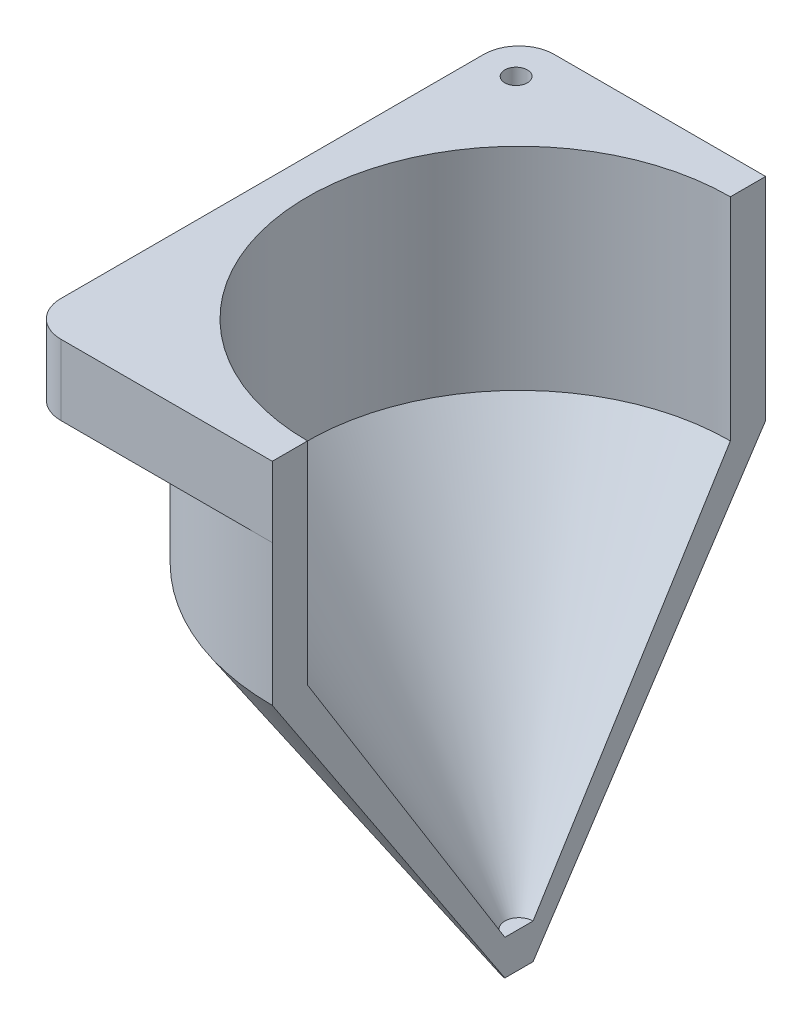
ISO-10303-21;
HEADER;
FILE_DESCRIPTION(('STEP AP214'),'2;1');
FILE_NAME('part.step','',(''),(''),'','','');
FILE_SCHEMA(('AUTOMOTIVE_DESIGN { 1 0 10303 214 1 1 1 1 }'));
ENDSEC;
DATA;
#1=APPLICATION_CONTEXT('core data for automotive mechanical design processes');
#2=APPLICATION_PROTOCOL_DEFINITION('international standard','automotive_design',2000,#1);
#3=PRODUCT_CONTEXT('',#1,'mechanical');
#4=PRODUCT('Part','Part','',(#3));
#5=PRODUCT_RELATED_PRODUCT_CATEGORY('part','',(#4));
#6=PRODUCT_DEFINITION_FORMATION('','',#4);
#7=PRODUCT_DEFINITION_CONTEXT('part definition',#1,'design');
#8=PRODUCT_DEFINITION('design','',#6,#7);
#9=PRODUCT_DEFINITION_SHAPE('','',#8);
#10=(LENGTH_UNIT() NAMED_UNIT(*) SI_UNIT(.MILLI.,.METRE.));
#11=(NAMED_UNIT(*) PLANE_ANGLE_UNIT() SI_UNIT($,.RADIAN.));
#12=(NAMED_UNIT(*) SI_UNIT($,.STERADIAN.) SOLID_ANGLE_UNIT());
#13=UNCERTAINTY_MEASURE_WITH_UNIT(LENGTH_MEASURE(1.E-05),#10,'distance_accuracy_value','');
#14=(GEOMETRIC_REPRESENTATION_CONTEXT(3) GLOBAL_UNCERTAINTY_ASSIGNED_CONTEXT((#13)) GLOBAL_UNIT_ASSIGNED_CONTEXT((#10,
#11,#12)) REPRESENTATION_CONTEXT('',''));
#15=CARTESIAN_POINT('',(0.,0.,0.));
#16=DIRECTION('',(0.,0.,1.));
#17=DIRECTION('',(1.,0.,0.));
#18=AXIS2_PLACEMENT_3D('',#15,#16,#17);
#19=CARTESIAN_POINT('',(0.,0.,0.));
#20=DIRECTION('',(1.,0.,0.));
#21=DIRECTION('',(0.,0.,-1.));
#22=AXIS2_PLACEMENT_3D('',#19,#20,#21);
#23=PLANE('',#22);
#24=DIRECTION('',(0.,-1.,0.));
#25=VECTOR('',#24,1.);
#26=CARTESIAN_POINT('',(0.,30.,-30.));
#27=LINE('',#26,#25);
#28=CARTESIAN_POINT('',(0.,0.,-30.));
#29=VERTEX_POINT('',#28);
#30=CARTESIAN_POINT('',(0.,30.,-30.));
#31=VERTEX_POINT('',#30);
#32=EDGE_CURVE('E216',#29,#31,#27,.F.);
#33=ORIENTED_EDGE('',*,*,#32,.F.);
#34=DIRECTION('',(0.,0.849056603773585,-0.528301886792453));
#35=VECTOR('',#34,1.);
#36=CARTESIAN_POINT('',(0.,-48.2142857142857,0.));
#37=LINE('',#36,#35);
#38=CARTESIAN_POINT('',(0.,-45.,-2.));
#39=VERTEX_POINT('',#38);
#40=EDGE_CURVE('E232',#29,#39,#37,.F.);
#41=ORIENTED_EDGE('',*,*,#40,.T.);
#42=DIRECTION('',(0.,0.,1.));
#43=VECTOR('',#42,1.);
#44=CARTESIAN_POINT('',(0.,-45.,0.));
#45=LINE('',#44,#43);
#46=CARTESIAN_POINT('',(0.,-45.,2.));
#47=VERTEX_POINT('',#46);
#48=EDGE_CURVE('E228',#39,#47,#45,.T.);
#49=ORIENTED_EDGE('',*,*,#48,.T.);
#50=DIRECTION('',(0.,-0.849056603773585,-0.528301886792453));
#51=VECTOR('',#50,1.);
#52=CARTESIAN_POINT('',(0.,-48.2142857142857,0.));
#53=LINE('',#52,#51);
#54=CARTESIAN_POINT('',(0.,0.,30.));
#55=VERTEX_POINT('',#54);
#56=EDGE_CURVE('E236',#47,#55,#53,.F.);
#57=ORIENTED_EDGE('',*,*,#56,.T.);
#58=DIRECTION('',(0.,-1.,0.));
#59=VECTOR('',#58,1.);
#60=CARTESIAN_POINT('',(0.,30.,30.));
#61=LINE('',#60,#59);
#62=CARTESIAN_POINT('',(0.,30.,30.));
#63=VERTEX_POINT('',#62);
#64=EDGE_CURVE('E219',#63,#55,#61,.T.);
#65=ORIENTED_EDGE('',*,*,#64,.F.);
#66=DIRECTION('',(0.,0.,-1.));
#67=VECTOR('',#66,1.);
#68=CARTESIAN_POINT('',(0.,30.,30.));
#69=LINE('',#68,#67);
#70=CARTESIAN_POINT('',(0.,30.,35.));
#71=VERTEX_POINT('',#70);
#72=EDGE_CURVE('E155',#71,#63,#69,.T.);
#73=ORIENTED_EDGE('',*,*,#72,.F.);
#74=DIRECTION('',(0.,1.,0.));
#75=VECTOR('',#74,1.);
#76=CARTESIAN_POINT('',(0.,30.,35.));
#77=LINE('',#76,#75);
#78=CARTESIAN_POINT('',(0.,20.,35.));
#79=VERTEX_POINT('',#78);
#80=EDGE_CURVE('E71',#79,#71,#77,.T.);
#81=ORIENTED_EDGE('',*,*,#80,.F.);
#82=DIRECTION('',(0.,-1.,0.));
#83=VECTOR('',#82,1.);
#84=CARTESIAN_POINT('',(0.,30.,35.));
#85=LINE('',#84,#83);
#86=CARTESIAN_POINT('',(0.,0.,35.));
#87=VERTEX_POINT('',#86);
#88=EDGE_CURVE('E138',#79,#87,#85,.T.);
#89=ORIENTED_EDGE('',*,*,#88,.T.);
#90=DIRECTION('',(0.,-0.834609406561725,-0.550842208330739));
#91=VECTOR('',#90,1.);
#92=CARTESIAN_POINT('',(0.,-53.030303030303,0.));
#93=LINE('',#92,#91);
#94=CARTESIAN_POINT('',(0.,-50.,2.));
#95=VERTEX_POINT('',#94);
#96=EDGE_CURVE('E153',#87,#95,#93,.T.);
#97=ORIENTED_EDGE('',*,*,#96,.T.);
#98=DIRECTION('',(0.,0.,-1.));
#99=VECTOR('',#98,1.);
#100=CARTESIAN_POINT('',(0.,-50.,0.));
#101=LINE('',#100,#99);
#102=CARTESIAN_POINT('',(0.,-50.,-2.));
#103=VERTEX_POINT('',#102);
#104=EDGE_CURVE('E163',#95,#103,#101,.T.);
#105=ORIENTED_EDGE('',*,*,#104,.T.);
#106=DIRECTION('',(0.,0.834609406561725,-0.550842208330739));
#107=VECTOR('',#106,1.);
#108=CARTESIAN_POINT('',(0.,-53.030303030303,0.));
#109=LINE('',#108,#107);
#110=CARTESIAN_POINT('',(0.,0.,-35.));
#111=VERTEX_POINT('',#110);
#112=EDGE_CURVE('E160',#103,#111,#109,.T.);
#113=ORIENTED_EDGE('',*,*,#112,.T.);
#114=DIRECTION('',(0.,-1.,0.));
#115=VECTOR('',#114,1.);
#116=CARTESIAN_POINT('',(0.,30.,-35.));
#117=LINE('',#116,#115);
#118=CARTESIAN_POINT('',(0.,20.,-35.));
#119=VERTEX_POINT('',#118);
#120=EDGE_CURVE('E141',#111,#119,#117,.F.);
#121=ORIENTED_EDGE('',*,*,#120,.T.);
#122=DIRECTION('',(0.,-1.,0.));
#123=VECTOR('',#122,1.);
#124=CARTESIAN_POINT('',(0.,30.,-35.));
#125=LINE('',#124,#123);
#126=CARTESIAN_POINT('',(0.,30.,-35.));
#127=VERTEX_POINT('',#126);
#128=EDGE_CURVE('E63',#127,#119,#125,.T.);
#129=ORIENTED_EDGE('',*,*,#128,.F.);
#130=EDGE_CURVE('E223',#31,#127,#69,.T.);
#131=ORIENTED_EDGE('',*,*,#130,.F.);
#132=EDGE_LOOP('',(#33,#41,#49,#57,#65,#73,#81,#89,#97,#105,#113,#121,#129,#131));
#133=FACE_BOUND('',#132,.T.);
#134=ADVANCED_FACE('F45',(#133),#23,.T.);
#135=CARTESIAN_POINT('',(-35.001,30.,35.));
#136=DIRECTION('',(0.,0.,1.));
#137=DIRECTION('',(1.,0.,0.));
#138=AXIS2_PLACEMENT_3D('',#135,#136,#137);
#139=PLANE('',#138);
#140=DIRECTION('',(-1.,0.,0.));
#141=VECTOR('',#140,1.);
#142=CARTESIAN_POINT('',(35.001,20.,35.));
#143=LINE('',#142,#141);
#144=CARTESIAN_POINT('',(-30.,20.,35.));
#145=VERTEX_POINT('',#144);
#146=EDGE_CURVE('E189',#79,#145,#143,.T.);
#147=ORIENTED_EDGE('',*,*,#146,.F.);
#148=ORIENTED_EDGE('',*,*,#80,.T.);
#149=DIRECTION('',(1.,0.,0.));
#150=VECTOR('',#149,1.);
#151=CARTESIAN_POINT('',(-35.001,30.,35.));
#152=LINE('',#151,#150);
#153=CARTESIAN_POINT('',(-30.,30.,35.));
#154=VERTEX_POINT('',#153);
#155=EDGE_CURVE('E49',#154,#71,#152,.T.);
#156=ORIENTED_EDGE('',*,*,#155,.F.);
#157=DIRECTION('',(0.,-1.,0.));
#158=VECTOR('',#157,1.);
#159=CARTESIAN_POINT('',(-30.,30.,35.));
#160=LINE('',#159,#158);
#161=EDGE_CURVE('E172',#154,#145,#160,.T.);
#162=ORIENTED_EDGE('',*,*,#161,.T.);
#163=EDGE_LOOP('',(#147,#148,#156,#162));
#164=FACE_BOUND('',#163,.T.);
#165=ADVANCED_FACE('F264',(#164),#139,.T.);
#166=CARTESIAN_POINT('',(35.001,20.,35.));
#167=DIRECTION('',(0.,1.,0.));
#168=DIRECTION('',(0.,0.,1.));
#169=AXIS2_PLACEMENT_3D('',#166,#167,#168);
#170=PLANE('',#169);
#171=ORIENTED_EDGE('',*,*,#146,.T.);
#172=CARTESIAN_POINT('',(-30.,20.,30.));
#173=DIRECTION('',(0.,1.,0.));
#174=DIRECTION('',(0.,0.,1.));
#175=AXIS2_PLACEMENT_3D('',#172,#173,#174);
#176=CIRCLE('',#175,5.);
#177=CARTESIAN_POINT('',(-35.,20.,30.));
#178=VERTEX_POINT('',#177);
#179=EDGE_CURVE('E290',#145,#178,#176,.F.);
#180=ORIENTED_EDGE('',*,*,#179,.T.);
#181=DIRECTION('',(0.,0.,-1.));
#182=VECTOR('',#181,1.);
#183=CARTESIAN_POINT('',(-35.,20.,35.));
#184=LINE('',#183,#182);
#185=CARTESIAN_POINT('',(-35.,20.,0.));
#186=VERTEX_POINT('',#185);
#187=EDGE_CURVE('E195',#178,#186,#184,.T.);
#188=ORIENTED_EDGE('',*,*,#187,.T.);
#189=CARTESIAN_POINT('',(0.,20.,0.));
#190=DIRECTION('',(0.,1.,0.));
#191=DIRECTION('',(0.,0.,1.));
#192=AXIS2_PLACEMENT_3D('',#189,#190,#191);
#193=CIRCLE('',#192,35.);
#194=EDGE_CURVE('E184',#79,#186,#193,.F.);
#195=ORIENTED_EDGE('',*,*,#194,.F.);
#196=EDGE_LOOP('',(#171,#180,#188,#195));
#197=FACE_BOUND('',#196,.T.);
#198=ADVANCED_FACE('F313',(#197),#170,.F.);
#199=CARTESIAN_POINT('',(-35.001,30.,-35.));
#200=DIRECTION('',(0.,0.,-1.));
#201=DIRECTION('',(-1.,0.,0.));
#202=AXIS2_PLACEMENT_3D('',#199,#200,#201);
#203=PLANE('',#202);
#204=DIRECTION('',(1.,0.,0.));
#205=VECTOR('',#204,1.);
#206=CARTESIAN_POINT('',(-35.001,30.,-35.));
#207=LINE('',#206,#205);
#208=CARTESIAN_POINT('',(-30.,30.,-35.));
#209=VERTEX_POINT('',#208);
#210=EDGE_CURVE('E178',#209,#127,#207,.T.);
#211=ORIENTED_EDGE('',*,*,#210,.T.);
#212=ORIENTED_EDGE('',*,*,#128,.T.);
#213=DIRECTION('',(-1.,0.,0.));
#214=VECTOR('',#213,1.);
#215=CARTESIAN_POINT('',(35.001,20.,-35.));
#216=LINE('',#215,#214);
#217=CARTESIAN_POINT('',(-30.,20.,-35.));
#218=VERTEX_POINT('',#217);
#219=EDGE_CURVE('E205',#119,#218,#216,.T.);
#220=ORIENTED_EDGE('',*,*,#219,.T.);
#221=DIRECTION('',(0.,1.,0.));
#222=VECTOR('',#221,1.);
#223=CARTESIAN_POINT('',(-30.,30.,-35.));
#224=LINE('',#223,#222);
#225=EDGE_CURVE('E275',#218,#209,#224,.T.);
#226=ORIENTED_EDGE('',*,*,#225,.T.);
#227=EDGE_LOOP('',(#211,#212,#220,#226));
#228=FACE_BOUND('',#227,.T.);
#229=ADVANCED_FACE('F323',(#228),#203,.T.);
#230=CARTESIAN_POINT('',(-35.,0.,0.));
#231=DIRECTION('',(-1.,0.,0.));
#232=DIRECTION('',(0.,0.,-1.));
#233=AXIS2_PLACEMENT_3D('',#230,#231,#232);
#234=PLANE('',#233);
#235=ORIENTED_EDGE('',*,*,#187,.F.);
#236=DIRECTION('',(0.,-1.,0.));
#237=VECTOR('',#236,1.);
#238=CARTESIAN_POINT('',(-35.,0.,30.));
#239=LINE('',#238,#237);
#240=CARTESIAN_POINT('',(-35.,30.,30.));
#241=VERTEX_POINT('',#240);
#242=EDGE_CURVE('E284',#178,#241,#239,.F.);
#243=ORIENTED_EDGE('',*,*,#242,.T.);
#244=DIRECTION('',(0.,0.,1.));
#245=VECTOR('',#244,1.);
#246=CARTESIAN_POINT('',(-35.,30.,35.));
#247=LINE('',#246,#245);
#248=CARTESIAN_POINT('',(-35.,30.,-30.));
#249=VERTEX_POINT('',#248);
#250=EDGE_CURVE('E199',#249,#241,#247,.T.);
#251=ORIENTED_EDGE('',*,*,#250,.F.);
#252=DIRECTION('',(0.,1.,0.));
#253=VECTOR('',#252,1.);
#254=CARTESIAN_POINT('',(-35.,0.,-30.));
#255=LINE('',#254,#253);
#256=CARTESIAN_POINT('',(-35.,20.,-30.));
#257=VERTEX_POINT('',#256);
#258=EDGE_CURVE('E287',#249,#257,#255,.F.);
#259=ORIENTED_EDGE('',*,*,#258,.T.);
#260=DIRECTION('',(0.,0.,-1.));
#261=VECTOR('',#260,1.);
#262=CARTESIAN_POINT('',(-35.,20.,35.));
#263=LINE('',#262,#261);
#264=EDGE_CURVE('E201',#186,#257,#263,.T.);
#265=ORIENTED_EDGE('',*,*,#264,.F.);
#266=EDGE_LOOP('',(#235,#243,#251,#259,#265));
#267=FACE_BOUND('',#266,.T.);
#268=ADVANCED_FACE('F315',(#267),#234,.T.);
#269=CARTESIAN_POINT('',(35.001,20.,35.));
#270=DIRECTION('',(0.,1.,0.));
#271=DIRECTION('',(0.,0.,1.));
#272=AXIS2_PLACEMENT_3D('',#269,#270,#271);
#273=PLANE('',#272);
#274=CARTESIAN_POINT('',(-30.,20.,-29.5959027597665));
#275=DIRECTION('',(0.,1.,0.));
#276=DIRECTION('',(0.,0.,1.));
#277=AXIS2_PLACEMENT_3D('',#274,#275,#276);
#278=CIRCLE('',#277,1.6);
#279=CARTESIAN_POINT('',(-30.,20.,-27.9959027597665));
#280=VERTEX_POINT('',#279);
#281=EDGE_CURVE('E55',#280,#280,#278,.T.);
#282=ORIENTED_EDGE('',*,*,#281,.T.);
#283=EDGE_LOOP('',(#282));
#284=FACE_BOUND('',#283,.T.);
#285=ORIENTED_EDGE('',*,*,#264,.T.);
#286=CARTESIAN_POINT('',(-30.,20.,-30.));
#287=DIRECTION('',(0.,1.,0.));
#288=DIRECTION('',(0.,0.,1.));
#289=AXIS2_PLACEMENT_3D('',#286,#287,#288);
#290=CIRCLE('',#289,5.);
#291=EDGE_CURVE('E213',#257,#218,#290,.F.);
#292=ORIENTED_EDGE('',*,*,#291,.T.);
#293=ORIENTED_EDGE('',*,*,#219,.F.);
#294=CARTESIAN_POINT('',(0.,20.,0.));
#295=DIRECTION('',(0.,1.,0.));
#296=DIRECTION('',(0.,0.,1.));
#297=AXIS2_PLACEMENT_3D('',#294,#295,#296);
#298=CIRCLE('',#297,35.);
#299=EDGE_CURVE('E206',#186,#119,#298,.F.);
#300=ORIENTED_EDGE('',*,*,#299,.F.);
#301=EDGE_LOOP('',(#285,#292,#293,#300));
#302=FACE_BOUND('',#301,.T.);
#303=ADVANCED_FACE('F318',(#284,#302),#273,.F.);
#304=CARTESIAN_POINT('',(-30.,30.,-30.));
#305=DIRECTION('',(0.,1.,0.));
#306=DIRECTION('',(0.,0.,1.));
#307=AXIS2_PLACEMENT_3D('',#304,#305,#306);
#308=CYLINDRICAL_SURFACE('',#307,5.);
#309=ORIENTED_EDGE('',*,*,#291,.F.);
#310=ORIENTED_EDGE('',*,*,#258,.F.);
#311=CARTESIAN_POINT('',(-30.,30.,-30.));
#312=DIRECTION('',(0.,1.,0.));
#313=DIRECTION('',(0.,0.,1.));
#314=AXIS2_PLACEMENT_3D('',#311,#312,#313);
#315=CIRCLE('',#314,5.);
#316=EDGE_CURVE('E281',#209,#249,#315,.T.);
#317=ORIENTED_EDGE('',*,*,#316,.F.);
#318=ORIENTED_EDGE('',*,*,#225,.F.);
#319=EDGE_LOOP('',(#309,#310,#317,#318));
#320=FACE_BOUND('',#319,.T.);
#321=ADVANCED_FACE('F322',(#320),#308,.T.);
#322=CARTESIAN_POINT('',(-30.,30.,30.));
#323=DIRECTION('',(0.,-1.,0.));
#324=DIRECTION('',(0.,0.,-1.));
#325=AXIS2_PLACEMENT_3D('',#322,#323,#324);
#326=CYLINDRICAL_SURFACE('',#325,5.);
#327=CARTESIAN_POINT('',(-30.,30.,30.));
#328=DIRECTION('',(0.,1.,0.));
#329=DIRECTION('',(0.,0.,1.));
#330=AXIS2_PLACEMENT_3D('',#327,#328,#329);
#331=CIRCLE('',#330,5.);
#332=EDGE_CURVE('E278',#241,#154,#331,.T.);
#333=ORIENTED_EDGE('',*,*,#332,.F.);
#334=ORIENTED_EDGE('',*,*,#242,.F.);
#335=ORIENTED_EDGE('',*,*,#179,.F.);
#336=ORIENTED_EDGE('',*,*,#161,.F.);
#337=EDGE_LOOP('',(#333,#334,#335,#336));
#338=FACE_BOUND('',#337,.T.);
#339=ADVANCED_FACE('F312',(#338),#326,.T.);
#340=CARTESIAN_POINT('',(-30.,-50.,-29.5959027597665));
#341=DIRECTION('',(0.,1.,0.));
#342=DIRECTION('',(0.,0.,1.));
#343=AXIS2_PLACEMENT_3D('',#340,#341,#342);
#344=CYLINDRICAL_SURFACE('',#343,1.6);
#345=CARTESIAN_POINT('',(-30.,30.,-29.5959027597665));
#346=DIRECTION('',(0.,1.,0.));
#347=DIRECTION('',(0.,0.,1.));
#348=AXIS2_PLACEMENT_3D('',#345,#346,#347);
#349=CIRCLE('',#348,1.6);
#350=CARTESIAN_POINT('',(-30.,30.,-27.9959027597665));
#351=VERTEX_POINT('',#350);
#352=EDGE_CURVE('E11',#351,#351,#349,.T.);
#353=ORIENTED_EDGE('',*,*,#352,.T.);
#354=EDGE_LOOP('',(#353));
#355=FACE_BOUND('',#354,.T.);
#356=ORIENTED_EDGE('',*,*,#281,.F.);
#357=EDGE_LOOP('',(#356));
#358=FACE_BOUND('',#357,.T.);
#359=ADVANCED_FACE('F250',(#355,#358),#344,.F.);
#360=CARTESIAN_POINT('',(0.,30.,0.));
#361=DIRECTION('',(0.,-1.,0.));
#362=DIRECTION('',(0.,0.,-1.));
#363=AXIS2_PLACEMENT_3D('',#360,#361,#362);
#364=CYLINDRICAL_SURFACE('',#363,35.);
#365=ORIENTED_EDGE('',*,*,#88,.F.);
#366=ORIENTED_EDGE('',*,*,#194,.T.);
#367=ORIENTED_EDGE('',*,*,#299,.T.);
#368=ORIENTED_EDGE('',*,*,#120,.F.);
#369=CARTESIAN_POINT('',(0.,0.,0.));
#370=DIRECTION('',(0.,1.,0.));
#371=DIRECTION('',(-1.,0.,0.));
#372=AXIS2_PLACEMENT_3D('',#369,#370,#371);
#373=CIRCLE('',#372,35.);
#374=EDGE_CURVE('E135',#111,#87,#373,.T.);
#375=ORIENTED_EDGE('',*,*,#374,.T.);
#376=EDGE_LOOP('',(#365,#366,#367,#368,#375));
#377=FACE_BOUND('',#376,.T.);
#378=ADVANCED_FACE('F136',(#377),#364,.T.);
#379=CARTESIAN_POINT('',(2.00000000000001,-50.,0.));
#380=DIRECTION('',(0.,1.,0.));
#381=DIRECTION('',(-1.,0.,0.));
#382=AXIS2_PLACEMENT_3D('',#379,#380,#381);
#383=PLANE('',#382);
#384=ORIENTED_EDGE('',*,*,#104,.F.);
#385=CARTESIAN_POINT('',(0.,-50.,0.));
#386=DIRECTION('',(0.,1.,0.));
#387=DIRECTION('',(-1.,0.,0.));
#388=AXIS2_PLACEMENT_3D('',#385,#386,#387);
#389=CIRCLE('',#388,2.);
#390=EDGE_CURVE('E147',#103,#95,#389,.T.);
#391=ORIENTED_EDGE('',*,*,#390,.F.);
#392=EDGE_LOOP('',(#384,#391));
#393=FACE_BOUND('',#392,.T.);
#394=ADVANCED_FACE('F241',(#393),#383,.F.);
#395=CARTESIAN_POINT('',(0.,-50.,0.));
#396=DIRECTION('',(0.,1.,0.));
#397=DIRECTION('',(-1.,0.,0.));
#398=AXIS2_PLACEMENT_3D('',#395,#396,#397);
#399=CONICAL_SURFACE('',#398,2.,0.583373006993856);
#400=ORIENTED_EDGE('',*,*,#112,.F.);
#401=ORIENTED_EDGE('',*,*,#390,.T.);
#402=ORIENTED_EDGE('',*,*,#96,.F.);
#403=ORIENTED_EDGE('',*,*,#374,.F.);
#404=EDGE_LOOP('',(#400,#401,#402,#403));
#405=FACE_BOUND('',#404,.T.);
#406=ADVANCED_FACE('F157',(#405),#399,.T.);
#407=CARTESIAN_POINT('',(0.,30.,0.));
#408=DIRECTION('',(0.,1.,0.));
#409=DIRECTION('',(0.,0.,1.));
#410=AXIS2_PLACEMENT_3D('',#407,#408,#409);
#411=PLANE('',#410);
#412=ORIENTED_EDGE('',*,*,#352,.F.);
#413=EDGE_LOOP('',(#412));
#414=FACE_BOUND('',#413,.T.);
#415=ORIENTED_EDGE('',*,*,#155,.T.);
#416=ORIENTED_EDGE('',*,*,#72,.T.);
#417=CARTESIAN_POINT('',(0.,30.,0.));
#418=DIRECTION('',(0.,1.,0.));
#419=DIRECTION('',(0.,0.,1.));
#420=AXIS2_PLACEMENT_3D('',#417,#418,#419);
#421=CIRCLE('',#420,30.);
#422=EDGE_CURVE('E167',#31,#63,#421,.T.);
#423=ORIENTED_EDGE('',*,*,#422,.F.);
#424=ORIENTED_EDGE('',*,*,#130,.T.);
#425=ORIENTED_EDGE('',*,*,#210,.F.);
#426=ORIENTED_EDGE('',*,*,#316,.T.);
#427=ORIENTED_EDGE('',*,*,#250,.T.);
#428=ORIENTED_EDGE('',*,*,#332,.T.);
#429=EDGE_LOOP('',(#415,#416,#423,#424,#425,#426,#427,#428));
#430=FACE_BOUND('',#429,.T.);
#431=ADVANCED_FACE('F248',(#414,#430),#411,.T.);
#432=CARTESIAN_POINT('',(0.,-45.,0.));
#433=DIRECTION('',(0.,-1.,0.));
#434=DIRECTION('',(1.,0.,0.));
#435=AXIS2_PLACEMENT_3D('',#432,#433,#434);
#436=PLANE('',#435);
#437=ORIENTED_EDGE('',*,*,#48,.F.);
#438=CARTESIAN_POINT('',(0.,-45.,0.));
#439=DIRECTION('',(0.,1.,0.));
#440=DIRECTION('',(-1.,0.,0.));
#441=AXIS2_PLACEMENT_3D('',#438,#439,#440);
#442=CIRCLE('',#441,2.);
#443=EDGE_CURVE('E148',#39,#47,#442,.T.);
#444=ORIENTED_EDGE('',*,*,#443,.T.);
#445=EDGE_LOOP('',(#437,#444));
#446=FACE_BOUND('',#445,.T.);
#447=ADVANCED_FACE('F252',(#446),#436,.F.);
#448=CARTESIAN_POINT('',(0.,30.,0.));
#449=DIRECTION('',(0.,-1.,0.));
#450=DIRECTION('',(0.,0.,-1.));
#451=AXIS2_PLACEMENT_3D('',#448,#449,#450);
#452=CYLINDRICAL_SURFACE('',#451,30.);
#453=ORIENTED_EDGE('',*,*,#422,.T.);
#454=ORIENTED_EDGE('',*,*,#64,.T.);
#455=CARTESIAN_POINT('',(0.,0.,0.));
#456=DIRECTION('',(0.,1.,0.));
#457=DIRECTION('',(0.,0.,1.));
#458=AXIS2_PLACEMENT_3D('',#455,#456,#457);
#459=CIRCLE('',#458,30.);
#460=EDGE_CURVE('E171',#29,#55,#459,.T.);
#461=ORIENTED_EDGE('',*,*,#460,.F.);
#462=ORIENTED_EDGE('',*,*,#32,.T.);
#463=EDGE_LOOP('',(#453,#454,#461,#462));
#464=FACE_BOUND('',#463,.T.);
#465=ADVANCED_FACE('F254',(#464),#452,.F.);
#466=CARTESIAN_POINT('',(0.,0.,0.));
#467=DIRECTION('',(0.,1.,0.));
#468=DIRECTION('',(-1.,0.,0.));
#469=AXIS2_PLACEMENT_3D('',#466,#467,#468);
#470=CONICAL_SURFACE('',#469,30.,0.556599318010223);
#471=ORIENTED_EDGE('',*,*,#40,.F.);
#472=ORIENTED_EDGE('',*,*,#460,.T.);
#473=ORIENTED_EDGE('',*,*,#56,.F.);
#474=ORIENTED_EDGE('',*,*,#443,.F.);
#475=EDGE_LOOP('',(#471,#472,#473,#474));
#476=FACE_BOUND('',#475,.T.);
#477=ADVANCED_FACE('F47',(#476),#470,.F.);
#478=CLOSED_SHELL('',(#134,#165,#198,#229,#268,#303,#321,#339,#359,#378,#394,#406,#431,#447,
#465,#477));
#479=MANIFOLD_SOLID_BREP('B2',#478);
#480=ADVANCED_BREP_SHAPE_REPRESENTATION('',(#18,#479),#14);
#481=SHAPE_DEFINITION_REPRESENTATION(#9,#480);
ENDSEC;
END-ISO-10303-21;
